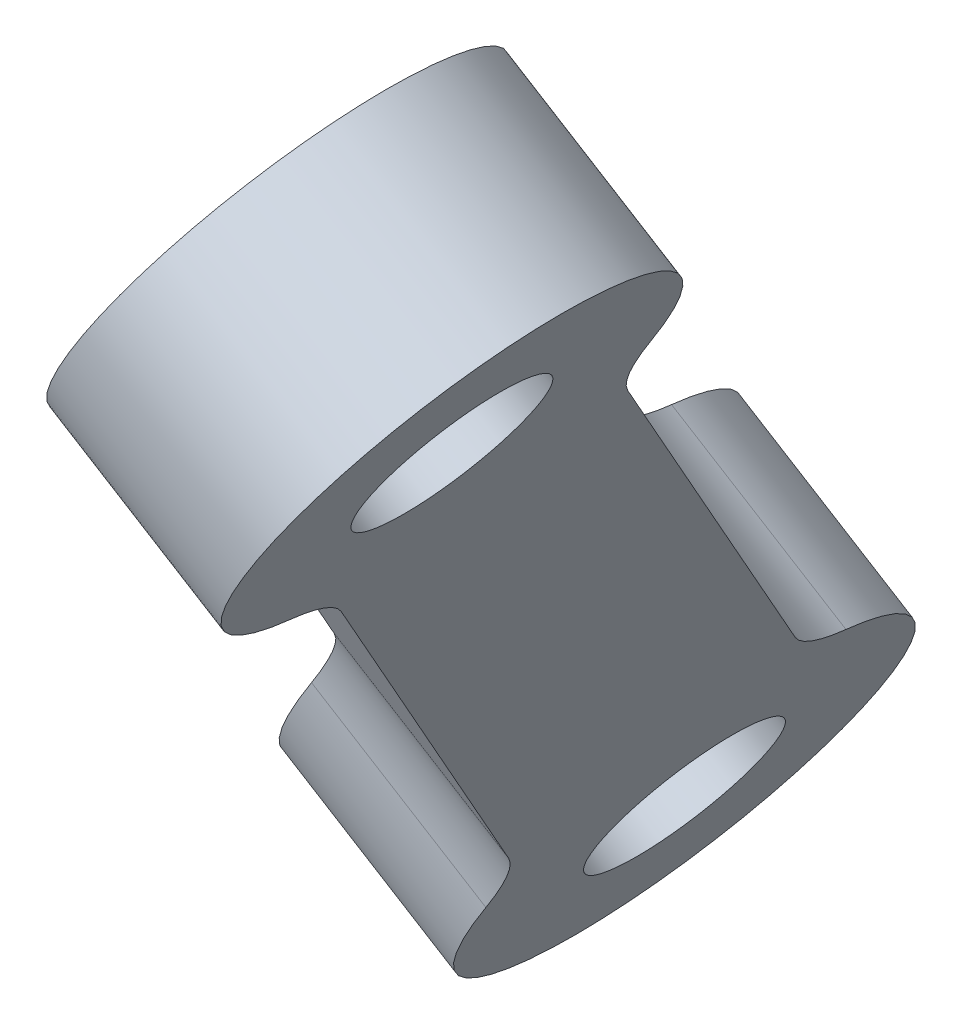
ISO-10303-21;
HEADER;
FILE_DESCRIPTION(('STEP AP214'),'2;1');
FILE_NAME('part.step','',(''),(''),'','','');
FILE_SCHEMA(('AUTOMOTIVE_DESIGN { 1 0 10303 214 1 1 1 1 }'));
ENDSEC;
DATA;
#1=APPLICATION_CONTEXT('core data for automotive mechanical design processes');
#2=APPLICATION_PROTOCOL_DEFINITION('international standard','automotive_design',2000,#1);
#3=PRODUCT_CONTEXT('',#1,'mechanical');
#4=PRODUCT('Part','Part','',(#3));
#5=PRODUCT_RELATED_PRODUCT_CATEGORY('part','',(#4));
#6=PRODUCT_DEFINITION_FORMATION('','',#4);
#7=PRODUCT_DEFINITION_CONTEXT('part definition',#1,'design');
#8=PRODUCT_DEFINITION('design','',#6,#7);
#9=PRODUCT_DEFINITION_SHAPE('','',#8);
#10=(LENGTH_UNIT() NAMED_UNIT(*) SI_UNIT(.MILLI.,.METRE.));
#11=(NAMED_UNIT(*) PLANE_ANGLE_UNIT() SI_UNIT($,.RADIAN.));
#12=(NAMED_UNIT(*) SI_UNIT($,.STERADIAN.) SOLID_ANGLE_UNIT());
#13=UNCERTAINTY_MEASURE_WITH_UNIT(LENGTH_MEASURE(1.E-05),#10,'distance_accuracy_value','');
#14=(GEOMETRIC_REPRESENTATION_CONTEXT(3) GLOBAL_UNCERTAINTY_ASSIGNED_CONTEXT((#13)) GLOBAL_UNIT_ASSIGNED_CONTEXT((#10,
#11,#12)) REPRESENTATION_CONTEXT('',''));
#15=CARTESIAN_POINT('',(0.,0.,0.));
#16=DIRECTION('',(0.,0.,1.));
#17=DIRECTION('',(1.,0.,0.));
#18=AXIS2_PLACEMENT_3D('',#15,#16,#17);
#19=CARTESIAN_POINT('',(-134.805143501858,232.893803125045,90.5474409174135));
#20=DIRECTION('',(-0.849388113162932,0.527762814669667,0.00249893366544743));
#21=DIRECTION('',(-0.527764462529551,-0.849390765249361,0.));
#22=AXIS2_PLACEMENT_3D('',#19,#20,#21);
#23=CYLINDRICAL_SURFACE('',#22,2.99999999999986);
#24=CARTESIAN_POINT('',(-138.202695954509,235.004854383724,90.5574366520753));
#25=DIRECTION('',(0.849388113162933,-0.527762814669667,-0.00249893366544743));
#26=DIRECTION('',(0.527764462529551,0.849390765249361,0.));
#27=AXIS2_PLACEMENT_3D('',#24,#25,#26);
#28=CIRCLE('',#27,2.99999999999986);
#29=CARTESIAN_POINT('',(-137.292181654821,236.481835615421,88.1100931634584));
#30=VERTEX_POINT('',#29);
#31=CARTESIAN_POINT('',(-136.686027982471,237.449821806389,89.7078175817281));
#32=VERTEX_POINT('',#31);
#33=EDGE_CURVE('E136',#30,#32,#28,.T.);
#34=ORIENTED_EDGE('',*,*,#33,.F.);
#35=DIRECTION('',(-0.849388113162932,0.527762814669667,0.00249893366544743));
#36=VECTOR('',#35,1.);
#37=CARTESIAN_POINT('',(-133.894629202169,234.370784356742,88.1000974287966));
#38=LINE('',#37,#36);
#39=CARTESIAN_POINT('',(-133.894629202169,234.370784356742,88.1000974287966));
#40=VERTEX_POINT('',#39);
#41=EDGE_CURVE('E11',#40,#30,#38,.T.);
#42=ORIENTED_EDGE('',*,*,#41,.F.);
#43=CARTESIAN_POINT('',(-134.805143501858,232.893803125045,90.5474409174135));
#44=DIRECTION('',(0.849388113162933,-0.527762814669667,-0.00249893366544743));
#45=DIRECTION('',(0.527764462529551,0.849390765249361,0.));
#46=AXIS2_PLACEMENT_3D('',#43,#44,#45);
#47=CIRCLE('',#46,2.99999999999986);
#48=CARTESIAN_POINT('',(-133.28847552982,235.33877054771,89.6978218470663));
#49=VERTEX_POINT('',#48);
#50=EDGE_CURVE('E160',#40,#49,#47,.T.);
#51=ORIENTED_EDGE('',*,*,#50,.T.);
#52=DIRECTION('',(-0.849388113162932,0.527762814669667,0.00249893366544743));
#53=VECTOR('',#52,1.);
#54=CARTESIAN_POINT('',(-133.28847552982,235.33877054771,89.6978218470663));
#55=LINE('',#54,#53);
#56=EDGE_CURVE('E45',#49,#32,#55,.T.);
#57=ORIENTED_EDGE('',*,*,#56,.T.);
#58=EDGE_LOOP('',(#34,#42,#51,#57));
#59=FACE_BOUND('',#58,.T.);
#60=ADVANCED_FACE('F39',(#59),#23,.F.);
#61=CARTESIAN_POINT('',(-143.54024468162,218.908186563002,75.1797870166888));
#62=DIRECTION('',(-0.303504766562868,-0.492327077232529,0.815781162872307));
#63=DIRECTION('',(0.,-0.856166610270368,-0.516699850452996));
#64=AXIS2_PLACEMENT_3D('',#61,#62,#63);
#65=PLANE('',#64);
#66=DIRECTION('',(0.431769255379691,0.692156384407184,0.578355297056439));
#67=VECTOR('',#66,1.);
#68=CARTESIAN_POINT('',(-146.937797134272,221.019237821681,75.1897827513506));
#69=LINE('',#68,#67);
#70=CARTESIAN_POINT('',(-146.937797134272,221.019237821681,75.1897827513506));
#71=VERTEX_POINT('',#70);
#72=EDGE_CURVE('E154',#71,#30,#69,.T.);
#73=ORIENTED_EDGE('',*,*,#72,.F.);
#74=DIRECTION('',(-0.849388113162932,0.527762814669667,0.00249893366544743));
#75=VECTOR('',#74,1.);
#76=CARTESIAN_POINT('',(-143.54024468162,218.908186563002,75.1797870166888));
#77=LINE('',#76,#75);
#78=CARTESIAN_POINT('',(-143.54024468162,218.908186563002,75.1797870166888));
#79=VERTEX_POINT('',#78);
#80=EDGE_CURVE('E48',#79,#71,#77,.T.);
#81=ORIENTED_EDGE('',*,*,#80,.F.);
#82=DIRECTION('',(0.431769255379691,0.692156384407184,0.578355297056439));
#83=VECTOR('',#82,1.);
#84=CARTESIAN_POINT('',(-143.54024468162,218.908186563002,75.1797870166888));
#85=LINE('',#84,#83);
#86=EDGE_CURVE('E127',#79,#40,#85,.T.);
#87=ORIENTED_EDGE('',*,*,#86,.T.);
#88=ORIENTED_EDGE('',*,*,#41,.T.);
#89=EDGE_LOOP('',(#73,#81,#87,#88));
#90=FACE_BOUND('',#89,.T.);
#91=ADVANCED_FACE('F166',(#90),#65,.T.);
#92=CARTESIAN_POINT('',(-144.450758981309,217.431205331304,77.6271305053057));
#93=DIRECTION('',(-0.849388113162932,0.527762814669667,0.00249893366544743));
#94=DIRECTION('',(-0.527764462529551,-0.849390765249361,0.));
#95=AXIS2_PLACEMENT_3D('',#92,#93,#94);
#96=CYLINDRICAL_SURFACE('',#95,2.99999999999999);
#97=CARTESIAN_POINT('',(-147.848311433961,219.542256589983,77.6371262399675));
#98=DIRECTION('',(0.849388113162933,-0.527762814669667,-0.00249893366544743));
#99=DIRECTION('',(0.527764462529551,0.849390765249361,0.));
#100=AXIS2_PLACEMENT_3D('',#97,#98,#99);
#101=CIRCLE('',#100,2.99999999999999);
#102=CARTESIAN_POINT('',(-147.934171220774,219.418259674271,74.6409198282025));
#103=VERTEX_POINT('',#102);
#104=EDGE_CURVE('E114',#103,#71,#101,.T.);
#105=ORIENTED_EDGE('',*,*,#104,.F.);
#106=DIRECTION('',(-0.849388113162932,0.527762814669667,0.00249893366544743));
#107=VECTOR('',#106,1.);
#108=CARTESIAN_POINT('',(-144.536618768122,217.307208415592,74.6309240935407));
#109=LINE('',#108,#107);
#110=CARTESIAN_POINT('',(-144.536618768122,217.307208415592,74.6309240935407));
#111=VERTEX_POINT('',#110);
#112=EDGE_CURVE('E107',#111,#103,#109,.T.);
#113=ORIENTED_EDGE('',*,*,#112,.F.);
#114=CARTESIAN_POINT('',(-144.450758981309,217.431205331304,77.6271305053057));
#115=DIRECTION('',(0.849388113162933,-0.527762814669667,-0.00249893366544743));
#116=DIRECTION('',(0.527764462529551,0.849390765249361,0.));
#117=AXIS2_PLACEMENT_3D('',#114,#115,#116);
#118=CIRCLE('',#117,2.99999999999999);
#119=EDGE_CURVE('E112',#111,#79,#118,.T.);
#120=ORIENTED_EDGE('',*,*,#119,.T.);
#121=ORIENTED_EDGE('',*,*,#80,.T.);
#122=EDGE_LOOP('',(#105,#113,#120,#121));
#123=FACE_BOUND('',#122,.T.);
#124=ADVANCED_FACE('F109',(#123),#96,.F.);
#125=CARTESIAN_POINT('',(-144.651098483873,217.141879194642,70.6359822111871));
#126=DIRECTION('',(-0.849388113162932,0.527762814669667,0.00249893366544743));
#127=DIRECTION('',(-0.527764462529551,-0.849390765249361,0.));
#128=AXIS2_PLACEMENT_3D('',#125,#126,#127);
#129=CYLINDRICAL_SURFACE('',#128,4.00000000000015);
#130=CARTESIAN_POINT('',(-148.048650936524,219.252930453321,70.6459779458489));
#131=DIRECTION('',(-0.849388113162933,0.527762814669667,0.00249893366544743));
#132=DIRECTION('',(-0.527764462529551,-0.849390765249361,0.));
#133=AXIS2_PLACEMENT_3D('',#130,#131,#132);
#134=CIRCLE('',#133,4.00000000000015);
#135=CARTESIAN_POINT('',(-146.026426973807,222.512887016875,69.5131525187193));
#136=VERTEX_POINT('',#135);
#137=EDGE_CURVE('E155',#136,#103,#134,.T.);
#138=ORIENTED_EDGE('',*,*,#137,.F.);
#139=DIRECTION('',(-0.849388113162932,0.527762814669667,0.00249893366544743));
#140=VECTOR('',#139,1.);
#141=CARTESIAN_POINT('',(-142.628874521155,220.401835758196,69.5031567840575));
#142=LINE('',#141,#140);
#143=CARTESIAN_POINT('',(-142.628874521155,220.401835758196,69.5031567840575));
#144=VERTEX_POINT('',#143);
#145=EDGE_CURVE('E119',#144,#136,#142,.T.);
#146=ORIENTED_EDGE('',*,*,#145,.F.);
#147=CARTESIAN_POINT('',(-144.651098483873,217.141879194642,70.6359822111871));
#148=DIRECTION('',(-0.849388113162933,0.527762814669667,0.00249893366544743));
#149=DIRECTION('',(-0.527764462529551,-0.849390765249361,0.));
#150=AXIS2_PLACEMENT_3D('',#147,#148,#149);
#151=CIRCLE('',#150,4.00000000000015);
#152=EDGE_CURVE('E123',#144,#111,#151,.T.);
#153=ORIENTED_EDGE('',*,*,#152,.T.);
#154=ORIENTED_EDGE('',*,*,#112,.T.);
#155=EDGE_LOOP('',(#138,#146,#153,#154));
#156=FACE_BOUND('',#155,.T.);
#157=ADVANCED_FACE('F126',(#156),#129,.T.);
#158=CARTESIAN_POINT('',(-141.112206549117,222.846803180862,68.6535377137103));
#159=DIRECTION('',(-0.849388113162932,0.527762814669667,0.00249893366544743));
#160=DIRECTION('',(-0.527764462529551,-0.849390765249361,0.));
#161=AXIS2_PLACEMENT_3D('',#158,#159,#160);
#162=CYLINDRICAL_SURFACE('',#161,2.99999999999989);
#163=CARTESIAN_POINT('',(-144.509759001769,224.957854439541,68.6635334483721));
#164=DIRECTION('',(0.849388113162933,-0.527762814669667,-0.00249893366544743));
#165=DIRECTION('',(0.527764462529551,0.849390765249361,0.));
#166=AXIS2_PLACEMENT_3D('',#163,#164,#165);
#167=CIRCLE('',#166,2.99999999999989);
#168=CARTESIAN_POINT('',(-145.420273301458,223.480873207843,71.110876936989));
#169=VERTEX_POINT('',#168);
#170=EDGE_CURVE('E149',#169,#136,#167,.T.);
#171=ORIENTED_EDGE('',*,*,#170,.F.);
#172=DIRECTION('',(-0.849388113162932,0.527762814669667,0.00249893366544743));
#173=VECTOR('',#172,1.);
#174=CARTESIAN_POINT('',(-142.022720848806,221.369821949164,71.1008812023272));
#175=LINE('',#174,#173);
#176=CARTESIAN_POINT('',(-142.022720848806,221.369821949164,71.1008812023272));
#177=VERTEX_POINT('',#176);
#178=EDGE_CURVE('E161',#177,#169,#175,.T.);
#179=ORIENTED_EDGE('',*,*,#178,.F.);
#180=CARTESIAN_POINT('',(-141.112206549117,222.846803180862,68.6535377137103));
#181=DIRECTION('',(0.849388113162933,-0.527762814669667,-0.00249893366544743));
#182=DIRECTION('',(0.527764462529551,0.849390765249361,0.));
#183=AXIS2_PLACEMENT_3D('',#180,#181,#182);
#184=CIRCLE('',#183,2.99999999999989);
#185=EDGE_CURVE('E129',#177,#144,#184,.T.);
#186=ORIENTED_EDGE('',*,*,#185,.T.);
#187=ORIENTED_EDGE('',*,*,#145,.T.);
#188=EDGE_LOOP('',(#171,#179,#186,#187));
#189=FACE_BOUND('',#188,.T.);
#190=ADVANCED_FACE('F185',(#189),#162,.F.);
#191=CARTESIAN_POINT('',(-132.377105369355,236.832419742905,84.021191614435));
#192=DIRECTION('',(0.303504766562867,0.492327077232528,-0.815781162872308));
#193=DIRECTION('',(0.,0.856166610270369,0.516699850452994));
#194=AXIS2_PLACEMENT_3D('',#191,#192,#193);
#195=PLANE('',#194);
#196=DIRECTION('',(-0.43176925537969,-0.692156384407186,-0.578355297056437));
#197=VECTOR('',#196,1.);
#198=CARTESIAN_POINT('',(-135.774657822006,238.943471001584,84.0311873490968));
#199=LINE('',#198,#197);
#200=CARTESIAN_POINT('',(-135.774657822006,238.943471001584,84.0311873490967));
#201=VERTEX_POINT('',#200);
#202=EDGE_CURVE('E148',#201,#169,#199,.T.);
#203=ORIENTED_EDGE('',*,*,#202,.F.);
#204=DIRECTION('',(-0.849388113162932,0.527762814669667,0.00249893366544743));
#205=VECTOR('',#204,1.);
#206=CARTESIAN_POINT('',(-132.377105369355,236.832419742905,84.021191614435));
#207=LINE('',#206,#205);
#208=CARTESIAN_POINT('',(-132.377105369355,236.832419742905,84.021191614435));
#209=VERTEX_POINT('',#208);
#210=EDGE_CURVE('E162',#209,#201,#207,.T.);
#211=ORIENTED_EDGE('',*,*,#210,.F.);
#212=DIRECTION('',(-0.43176925537969,-0.692156384407186,-0.578355297056437));
#213=VECTOR('',#212,1.);
#214=CARTESIAN_POINT('',(-132.377105369355,236.832419742905,84.021191614435));
#215=LINE('',#214,#213);
#216=EDGE_CURVE('E132',#209,#177,#215,.T.);
#217=ORIENTED_EDGE('',*,*,#216,.T.);
#218=ORIENTED_EDGE('',*,*,#178,.T.);
#219=EDGE_LOOP('',(#203,#211,#217,#218));
#220=FACE_BOUND('',#219,.T.);
#221=ADVANCED_FACE('F183',(#220),#195,.T.);
#222=CARTESIAN_POINT('',(-131.466591069666,238.309400974603,81.5738481258181));
#223=DIRECTION('',(-0.849388113162932,0.527762814669667,0.00249893366544743));
#224=DIRECTION('',(-0.527764462529551,-0.849390765249361,0.));
#225=AXIS2_PLACEMENT_3D('',#222,#223,#224);
#226=CYLINDRICAL_SURFACE('',#225,3.00000000000009);
#227=CARTESIAN_POINT('',(-134.864143522318,240.420452233282,81.5838438604799));
#228=DIRECTION('',(0.849388113162933,-0.527762814669667,-0.00249893366544743));
#229=DIRECTION('',(0.527764462529551,0.849390765249361,0.));
#230=AXIS2_PLACEMENT_3D('',#227,#228,#229);
#231=CIRCLE('',#230,3.00000000000009);
#232=CARTESIAN_POINT('',(-134.778283735505,240.544449148994,84.580050272245));
#233=VERTEX_POINT('',#232);
#234=EDGE_CURVE('E141',#233,#201,#231,.T.);
#235=ORIENTED_EDGE('',*,*,#234,.F.);
#236=DIRECTION('',(-0.849388113162932,0.527762814669667,0.00249893366544743));
#237=VECTOR('',#236,1.);
#238=CARTESIAN_POINT('',(-131.380731282853,238.433397890315,84.5700545375832));
#239=LINE('',#238,#237);
#240=CARTESIAN_POINT('',(-131.380731282853,238.433397890315,84.5700545375832));
#241=VERTEX_POINT('',#240);
#242=EDGE_CURVE('E163',#241,#233,#239,.T.);
#243=ORIENTED_EDGE('',*,*,#242,.F.);
#244=CARTESIAN_POINT('',(-131.466591069666,238.309400974603,81.5738481258181));
#245=DIRECTION('',(0.849388113162933,-0.527762814669667,-0.00249893366544743));
#246=DIRECTION('',(0.527764462529551,0.849390765249361,0.));
#247=AXIS2_PLACEMENT_3D('',#244,#245,#246);
#248=CIRCLE('',#247,3.00000000000009);
#249=EDGE_CURVE('E231',#241,#209,#248,.T.);
#250=ORIENTED_EDGE('',*,*,#249,.T.);
#251=ORIENTED_EDGE('',*,*,#210,.T.);
#252=EDGE_LOOP('',(#235,#243,#250,#251));
#253=FACE_BOUND('',#252,.T.);
#254=ADVANCED_FACE('F186',(#253),#226,.F.);
#255=CARTESIAN_POINT('',(-131.266251567102,238.598727111265,88.5649964199367));
#256=DIRECTION('',(-0.849388113162932,0.527762814669667,0.00249893366544743));
#257=DIRECTION('',(-0.527764462529551,-0.849390765249361,0.));
#258=AXIS2_PLACEMENT_3D('',#255,#256,#257);
#259=CYLINDRICAL_SURFACE('',#258,4.0000000000001);
#260=CARTESIAN_POINT('',(-134.663804019754,240.709778369943,88.5749921545985));
#261=DIRECTION('',(-0.849388113162933,0.527762814669667,0.00249893366544743));
#262=DIRECTION('',(-0.527764462529551,-0.849390765249361,0.));
#263=AXIS2_PLACEMENT_3D('',#260,#261,#262);
#264=CIRCLE('',#263,4.0000000000001);
#265=EDGE_CURVE('E138',#32,#233,#264,.T.);
#266=ORIENTED_EDGE('',*,*,#265,.F.);
#267=ORIENTED_EDGE('',*,*,#56,.F.);
#268=CARTESIAN_POINT('',(-131.266251567102,238.598727111265,88.5649964199367));
#269=DIRECTION('',(-0.849388113162933,0.527762814669667,0.00249893366544743));
#270=DIRECTION('',(-0.527764462529551,-0.849390765249361,0.));
#271=AXIS2_PLACEMENT_3D('',#268,#269,#270);
#272=CIRCLE('',#271,4.0000000000001);
#273=EDGE_CURVE('E226',#49,#241,#272,.T.);
#274=ORIENTED_EDGE('',*,*,#273,.T.);
#275=ORIENTED_EDGE('',*,*,#242,.T.);
#276=EDGE_LOOP('',(#266,#267,#274,#275));
#277=FACE_BOUND('',#276,.T.);
#278=ADVANCED_FACE('F167',(#277),#259,.T.);
#279=CARTESIAN_POINT('',(-134.805143501858,232.893803125045,90.5474409174135));
#280=DIRECTION('',(0.849388113162933,-0.527762814669667,-0.00249893366544743));
#281=DIRECTION('',(0.527764462529551,0.849390765249361,0.));
#282=AXIS2_PLACEMENT_3D('',#279,#280,#281);
#283=PLANE('',#282);
#284=CARTESIAN_POINT('',(-144.651098483873,217.141879194642,70.6359822111871));
#285=DIRECTION('',(-0.849388113162933,0.527762814669667,0.00249893366544743));
#286=DIRECTION('',(0.527764462529551,0.849390765249361,0.));
#287=AXIS2_PLACEMENT_3D('',#284,#285,#286);
#288=CIRCLE('',#287,1.75000000000001);
#289=CARTESIAN_POINT('',(-145.574686293299,215.655445355455,70.6359822111871));
#290=VERTEX_POINT('',#289);
#291=EDGE_CURVE('E216',#290,#290,#288,.T.);
#292=ORIENTED_EDGE('',*,*,#291,.T.);
#293=EDGE_LOOP('',(#292));
#294=FACE_BOUND('',#293,.T.);
#295=CARTESIAN_POINT('',(-131.266251567102,238.598727111265,88.5649964199367));
#296=DIRECTION('',(-0.849388113162933,0.527762814669667,0.00249893366544743));
#297=DIRECTION('',(0.527764462529551,0.849390765249361,0.));
#298=AXIS2_PLACEMENT_3D('',#295,#296,#297);
#299=CIRCLE('',#298,1.75);
#300=CARTESIAN_POINT('',(-132.189839376529,237.112293272078,88.5649964199367));
#301=VERTEX_POINT('',#300);
#302=EDGE_CURVE('E140',#301,#301,#299,.T.);
#303=ORIENTED_EDGE('',*,*,#302,.T.);
#304=EDGE_LOOP('',(#303));
#305=FACE_BOUND('',#304,.T.);
#306=ORIENTED_EDGE('',*,*,#50,.F.);
#307=ORIENTED_EDGE('',*,*,#86,.F.);
#308=ORIENTED_EDGE('',*,*,#119,.F.);
#309=ORIENTED_EDGE('',*,*,#152,.F.);
#310=ORIENTED_EDGE('',*,*,#185,.F.);
#311=ORIENTED_EDGE('',*,*,#216,.F.);
#312=ORIENTED_EDGE('',*,*,#249,.F.);
#313=ORIENTED_EDGE('',*,*,#273,.F.);
#314=EDGE_LOOP('',(#306,#307,#308,#309,#310,#311,#312,#313));
#315=FACE_BOUND('',#314,.T.);
#316=ADVANCED_FACE('F122',(#294,#305,#315),#283,.T.);
#317=CARTESIAN_POINT('',(-138.202695954509,235.004854383724,90.5574366520753));
#318=DIRECTION('',(0.849388113162933,-0.527762814669667,-0.00249893366544743));
#319=DIRECTION('',(0.527764462529551,0.849390765249361,0.));
#320=AXIS2_PLACEMENT_3D('',#317,#318,#319);
#321=PLANE('',#320);
#322=CARTESIAN_POINT('',(-148.048650936524,219.252930453321,70.6459779458489));
#323=DIRECTION('',(-0.849388113162933,0.527762814669667,0.00249893366544743));
#324=DIRECTION('',(0.527764462529551,0.849390765249361,0.));
#325=AXIS2_PLACEMENT_3D('',#322,#323,#324);
#326=CIRCLE('',#325,1.75000000000001);
#327=CARTESIAN_POINT('',(-148.972238745951,217.766496614134,70.6459779458489));
#328=VERTEX_POINT('',#327);
#329=EDGE_CURVE('E218',#328,#328,#326,.T.);
#330=ORIENTED_EDGE('',*,*,#329,.F.);
#331=EDGE_LOOP('',(#330));
#332=FACE_BOUND('',#331,.T.);
#333=CARTESIAN_POINT('',(-134.663804019754,240.709778369943,88.5749921545985));
#334=DIRECTION('',(-0.849388113162933,0.527762814669667,0.00249893366544743));
#335=DIRECTION('',(0.527764462529551,0.849390765249361,0.));
#336=AXIS2_PLACEMENT_3D('',#333,#334,#335);
#337=CIRCLE('',#336,1.75);
#338=CARTESIAN_POINT('',(-135.587391829181,239.223344530757,88.5749921545985));
#339=VERTEX_POINT('',#338);
#340=EDGE_CURVE('E222',#339,#339,#337,.T.);
#341=ORIENTED_EDGE('',*,*,#340,.F.);
#342=EDGE_LOOP('',(#341));
#343=FACE_BOUND('',#342,.T.);
#344=ORIENTED_EDGE('',*,*,#33,.T.);
#345=ORIENTED_EDGE('',*,*,#265,.T.);
#346=ORIENTED_EDGE('',*,*,#234,.T.);
#347=ORIENTED_EDGE('',*,*,#202,.T.);
#348=ORIENTED_EDGE('',*,*,#170,.T.);
#349=ORIENTED_EDGE('',*,*,#137,.T.);
#350=ORIENTED_EDGE('',*,*,#104,.T.);
#351=ORIENTED_EDGE('',*,*,#72,.T.);
#352=EDGE_LOOP('',(#344,#345,#346,#347,#348,#349,#350,#351));
#353=FACE_BOUND('',#352,.T.);
#354=ADVANCED_FACE('F169',(#332,#343,#353),#321,.F.);
#355=CARTESIAN_POINT('',(-131.266251567102,238.598727111265,88.5649964199367));
#356=DIRECTION('',(-0.849388113162932,0.527762814669667,0.00249893366544743));
#357=DIRECTION('',(-0.527764462529551,-0.849390765249361,0.));
#358=AXIS2_PLACEMENT_3D('',#355,#356,#357);
#359=CYLINDRICAL_SURFACE('',#358,1.75);
#360=CARTESIAN_POINT('',(-132.189839376529,237.112293272078,88.5649964199367));
#361=CARTESIAN_POINT('',(-132.225230547911,237.134283389356,88.5651005421728));
#362=CARTESIAN_POINT('',(-132.260621719293,237.156273506634,88.5652046644089));
#363=CARTESIAN_POINT('',(-132.331404062056,237.20025374119,88.565412908881));
#364=CARTESIAN_POINT('',(-132.366795233438,237.222243858468,88.565517031117));
#365=CARTESIAN_POINT('',(-132.437577576202,237.266224093024,88.5657252755891));
#366=CARTESIAN_POINT('',(-132.472968747583,237.288214210302,88.5658293978252));
#367=CARTESIAN_POINT('',(-132.543751090347,237.332194444857,88.5660376422973));
#368=CARTESIAN_POINT('',(-132.579142261729,237.354184562135,88.5661417645334));
#369=CARTESIAN_POINT('',(-132.649924604492,237.398164796691,88.5663500090055));
#370=CARTESIAN_POINT('',(-132.685315775874,237.420154913969,88.5664541312416));
#371=CARTESIAN_POINT('',(-132.756098118638,237.464135148525,88.5666623757137));
#372=CARTESIAN_POINT('',(-132.791489290019,237.486125265803,88.5667664979498));
#373=CARTESIAN_POINT('',(-132.862271632783,237.530105500359,88.5669747424219));
#374=CARTESIAN_POINT('',(-132.897662804165,237.552095617636,88.5670788646579));
#375=CARTESIAN_POINT('',(-132.968445146928,237.596075852192,88.5672871091301));
#376=CARTESIAN_POINT('',(-133.00383631831,237.61806596947,88.5673912313661));
#377=CARTESIAN_POINT('',(-133.074618661074,237.662046204026,88.5675994758383));
#378=CARTESIAN_POINT('',(-133.110009832455,237.684036321304,88.5677035980743));
#379=CARTESIAN_POINT('',(-133.180792175219,237.72801655586,88.5679118425464));
#380=CARTESIAN_POINT('',(-133.216183346601,237.750006673138,88.5680159647825));
#381=CARTESIAN_POINT('',(-133.286965689364,237.793986907693,88.5682242092546));
#382=CARTESIAN_POINT('',(-133.322356860746,237.815977024971,88.5683283314907));
#383=CARTESIAN_POINT('',(-133.39313920351,237.859957259527,88.5685365759628));
#384=CARTESIAN_POINT('',(-133.428530374892,237.881947376805,88.5686406981988));
#385=CARTESIAN_POINT('',(-133.499312717655,237.925927611361,88.568848942671));
#386=CARTESIAN_POINT('',(-133.534703889037,237.947917728639,88.568953064907));
#387=CARTESIAN_POINT('',(-133.605486231801,237.991897963195,88.5691613093791));
#388=CARTESIAN_POINT('',(-133.640877403182,238.013888080472,88.5692654316152));
#389=CARTESIAN_POINT('',(-133.711659745946,238.057868315028,88.5694736760873));
#390=CARTESIAN_POINT('',(-133.747050917328,238.079858432306,88.5695777983234));
#391=CARTESIAN_POINT('',(-133.817833260091,238.123838666862,88.5697860427955));
#392=CARTESIAN_POINT('',(-133.853224431473,238.14582878414,88.5698901650316));
#393=CARTESIAN_POINT('',(-133.924006774237,238.189809018696,88.5700984095037));
#394=CARTESIAN_POINT('',(-133.959397945618,238.211799135974,88.5702025317398));
#395=CARTESIAN_POINT('',(-134.030180288382,238.255779370529,88.5704107762119));
#396=CARTESIAN_POINT('',(-134.065571459764,238.277769487807,88.5705148984479));
#397=CARTESIAN_POINT('',(-134.136353802527,238.321749722363,88.57072314292));
#398=CARTESIAN_POINT('',(-134.171744973909,238.343739839641,88.5708272651561));
#399=CARTESIAN_POINT('',(-134.242527316673,238.387720074197,88.5710355096282));
#400=CARTESIAN_POINT('',(-134.277918488054,238.409710191475,88.5711396318643));
#401=CARTESIAN_POINT('',(-134.348700830818,238.453690426031,88.5713478763364));
#402=CARTESIAN_POINT('',(-134.3840920022,238.475680543308,88.5714519985725));
#403=CARTESIAN_POINT('',(-134.454874344963,238.519660777864,88.5716602430446));
#404=CARTESIAN_POINT('',(-134.490265516345,238.541650895142,88.5717643652807));
#405=CARTESIAN_POINT('',(-134.561047859109,238.585631129698,88.5719726097528));
#406=CARTESIAN_POINT('',(-134.596439030491,238.607621246976,88.5720767319888));
#407=CARTESIAN_POINT('',(-134.667221373254,238.651601481532,88.5722849764609));
#408=CARTESIAN_POINT('',(-134.702612544636,238.67359159881,88.572389098697));
#409=CARTESIAN_POINT('',(-134.7733948874,238.717571833365,88.5725973431692));
#410=CARTESIAN_POINT('',(-134.808786058781,238.739561950643,88.5727014654052));
#411=CARTESIAN_POINT('',(-134.879568401545,238.783542185199,88.5729097098773));
#412=CARTESIAN_POINT('',(-134.914959572927,238.805532302477,88.5730138321134));
#413=CARTESIAN_POINT('',(-134.98574191569,238.849512537033,88.5732220765855));
#414=CARTESIAN_POINT('',(-135.021133087072,238.871502654311,88.5733261988216));
#415=CARTESIAN_POINT('',(-135.091915429836,238.915482888866,88.5735344432937));
#416=CARTESIAN_POINT('',(-135.127306601217,238.937473006144,88.5736385655297));
#417=CARTESIAN_POINT('',(-135.198088943981,238.9814532407,88.5738468100019));
#418=CARTESIAN_POINT('',(-135.233480115363,239.003443357978,88.5739509322379));
#419=CARTESIAN_POINT('',(-135.304262458126,239.047423592534,88.57415917671));
#420=CARTESIAN_POINT('',(-135.339653629508,239.069413709812,88.5742632989461));
#421=CARTESIAN_POINT('',(-135.410435972272,239.113393944368,88.5744715434182));
#422=CARTESIAN_POINT('',(-135.445827143654,239.135384061645,88.5745756656543));
#423=CARTESIAN_POINT('',(-135.516609486417,239.179364296201,88.5747839101264));
#424=CARTESIAN_POINT('',(-135.552000657799,239.201354413479,88.5748880323625));
#425=CARTESIAN_POINT('',(-135.587391829181,239.223344530757,88.5749921545985));
#426=B_SPLINE_CURVE_WITH_KNOTS('',3,(#360,#361,#362,#363,#364,#365,#366,#367,#368,#369,#370,
#371,#372,#373,#374,#375,#376,#377,#378,#379,#380,#381,#382,#383,#384,#385,#386,#387,#388,#389,
#390,#391,#392,#393,#394,#395,#396,#397,#398,#399,#400,#401,#402,#403,#404,#405,#406,#407,#408,
#409,#410,#411,#412,#413,#414,#415,#416,#417,#418,#419,#420,#421,#422,#423,#424,#425),
.UNSPECIFIED.,.F.,.F.,(4,2,2,2,2,2,2,2,2,2,2,2,2,2,2,2,2,2,2,2,2,2,2,2,2,2,2,2,2,2,2,2,4),(0.,
0.124999999999983,0.24999999999999,0.374999999999988,0.499999999999972,0.624999999999978,0.75,
0.874999999999983,0.99999999999999,1.12499999999997,1.25,1.37499999999998,1.49999999999996,
1.62499999999998,1.74999999999999,1.87499999999997,1.99999999999997,2.12499999999998,
2.24999999999999,2.37499999999998,2.49999999999997,2.62499999999997,2.74999999999998,
2.87499999999998,2.99999999999996,3.12499999999997,3.24999999999999,3.37499999999997,
3.49999999999996,3.62499999999998,3.74999999999999,3.87499999999997,3.99999999999997),.UNSPECIFIED.);
#427=EDGE_CURVE('BSEAM203',#301,#339,#426,.T.);
#428=ORIENTED_EDGE('',*,*,#302,.F.);
#429=ORIENTED_EDGE('',*,*,#340,.T.);
#430=ORIENTED_EDGE('',*,*,#427,.T.);
#431=ORIENTED_EDGE('',*,*,#427,.F.);
#432=EDGE_LOOP('',(#428,#430,#429,#431));
#433=FACE_BOUND('',#432,.T.);
#434=ADVANCED_FACE('F203',(#433),#359,.F.);
#435=CARTESIAN_POINT('',(-144.651098483873,217.141879194642,70.6359822111871));
#436=DIRECTION('',(-0.849388113162932,0.527762814669667,0.00249893366544743));
#437=DIRECTION('',(-0.527764462529551,-0.849390765249361,0.));
#438=AXIS2_PLACEMENT_3D('',#435,#436,#437);
#439=CYLINDRICAL_SURFACE('',#438,1.75000000000001);
#440=CARTESIAN_POINT('',(-145.574686293299,215.655445355455,70.6359822111871));
#441=CARTESIAN_POINT('',(-145.610077464681,215.677435472733,70.6360863334232));
#442=CARTESIAN_POINT('',(-145.645468636063,215.699425590011,70.6361904556592));
#443=CARTESIAN_POINT('',(-145.716250978827,215.743405824567,70.6363987001314));
#444=CARTESIAN_POINT('',(-145.751642150208,215.765395941845,70.6365028223674));
#445=CARTESIAN_POINT('',(-145.822424492972,215.809376176401,70.6367110668395));
#446=CARTESIAN_POINT('',(-145.857815664354,215.831366293679,70.6368151890756));
#447=CARTESIAN_POINT('',(-145.928598007117,215.875346528235,70.6370234335477));
#448=CARTESIAN_POINT('',(-145.963989178499,215.897336645512,70.6371275557838));
#449=CARTESIAN_POINT('',(-146.034771521263,215.941316880068,70.6373358002559));
#450=CARTESIAN_POINT('',(-146.070162692645,215.963306997346,70.637439922492));
#451=CARTESIAN_POINT('',(-146.140945035408,216.007287231902,70.6376481669641));
#452=CARTESIAN_POINT('',(-146.17633620679,216.02927734918,70.6377522892002));
#453=CARTESIAN_POINT('',(-146.247118549554,216.073257583736,70.6379605336723));
#454=CARTESIAN_POINT('',(-146.282509720935,216.095247701014,70.6380646559083));
#455=CARTESIAN_POINT('',(-146.353292063699,216.139227935569,70.6382729003805));
#456=CARTESIAN_POINT('',(-146.388683235081,216.161218052847,70.6383770226165));
#457=CARTESIAN_POINT('',(-146.459465577844,216.205198287403,70.6385852670886));
#458=CARTESIAN_POINT('',(-146.494856749226,216.227188404681,70.6386893893247));
#459=CARTESIAN_POINT('',(-146.56563909199,216.271168639237,70.6388976337968));
#460=CARTESIAN_POINT('',(-146.601030263371,216.293158756515,70.6390017560329));
#461=CARTESIAN_POINT('',(-146.671812606135,216.33713899107,70.639210000505));
#462=CARTESIAN_POINT('',(-146.707203777517,216.359129108348,70.6393141227411));
#463=CARTESIAN_POINT('',(-146.77798612028,216.403109342904,70.6395223672132));
#464=CARTESIAN_POINT('',(-146.813377291662,216.425099460182,70.6396264894492));
#465=CARTESIAN_POINT('',(-146.884159634426,216.469079694738,70.6398347339213));
#466=CARTESIAN_POINT('',(-146.919550805807,216.491069812016,70.6399388561574));
#467=CARTESIAN_POINT('',(-146.990333148571,216.535050046572,70.6401471006295));
#468=CARTESIAN_POINT('',(-147.025724319953,216.55704016385,70.6402512228656));
#469=CARTESIAN_POINT('',(-147.096506662716,216.601020398405,70.6404594673377));
#470=CARTESIAN_POINT('',(-147.131897834098,216.623010515683,70.6405635895738));
#471=CARTESIAN_POINT('',(-147.202680176862,216.666990750239,70.6407718340459));
#472=CARTESIAN_POINT('',(-147.238071348244,216.688980867517,70.640875956282));
#473=CARTESIAN_POINT('',(-147.308853691007,216.732961102073,70.6410842007541));
#474=CARTESIAN_POINT('',(-147.344244862389,216.754951219351,70.6411883229901));
#475=CARTESIAN_POINT('',(-147.415027205153,216.798931453906,70.6413965674623));
#476=CARTESIAN_POINT('',(-147.450418376534,216.820921571184,70.6415006896983));
#477=CARTESIAN_POINT('',(-147.521200719298,216.86490180574,70.6417089341704));
#478=CARTESIAN_POINT('',(-147.55659189068,216.886891923018,70.6418130564065));
#479=CARTESIAN_POINT('',(-147.627374233443,216.930872157574,70.6420213008786));
#480=CARTESIAN_POINT('',(-147.662765404825,216.952862274852,70.6421254231147));
#481=CARTESIAN_POINT('',(-147.733547747589,216.996842509408,70.6423336675868));
#482=CARTESIAN_POINT('',(-147.76893891897,217.018832626685,70.6424377898229));
#483=CARTESIAN_POINT('',(-147.839721261734,217.062812861241,70.642646034295));
#484=CARTESIAN_POINT('',(-147.875112433116,217.084802978519,70.642750156531));
#485=CARTESIAN_POINT('',(-147.945894775879,217.128783213075,70.6429584010032));
#486=CARTESIAN_POINT('',(-147.981285947261,217.150773330353,70.6430625232392));
#487=CARTESIAN_POINT('',(-148.052068290025,217.194753564909,70.6432707677114));
#488=CARTESIAN_POINT('',(-148.087459461406,217.216743682187,70.6433748899474));
#489=CARTESIAN_POINT('',(-148.15824180417,217.260723916742,70.6435831344195));
#490=CARTESIAN_POINT('',(-148.193632975552,217.28271403402,70.6436872566556));
#491=CARTESIAN_POINT('',(-148.264415318315,217.326694268576,70.6438955011277));
#492=CARTESIAN_POINT('',(-148.299806489697,217.348684385854,70.6439996233638));
#493=CARTESIAN_POINT('',(-148.370588832461,217.39266462041,70.6442078678359));
#494=CARTESIAN_POINT('',(-148.405980003843,217.414654737688,70.644311990072));
#495=CARTESIAN_POINT('',(-148.476762346606,217.458634972244,70.6445202345441));
#496=CARTESIAN_POINT('',(-148.512153517988,217.480625089521,70.6446243567801));
#497=CARTESIAN_POINT('',(-148.582935860752,217.524605324077,70.6448326012522));
#498=CARTESIAN_POINT('',(-148.618327032133,217.546595441355,70.6449367234883));
#499=CARTESIAN_POINT('',(-148.689109374897,217.590575675911,70.6451449679604));
#500=CARTESIAN_POINT('',(-148.724500546279,217.612565793189,70.6452490901965));
#501=CARTESIAN_POINT('',(-148.795282889042,217.656546027745,70.6454573346686));
#502=CARTESIAN_POINT('',(-148.830674060424,217.678536145023,70.6455614569047));
#503=CARTESIAN_POINT('',(-148.901456403188,217.722516379578,70.6457697013768));
#504=CARTESIAN_POINT('',(-148.936847574569,217.744506496856,70.6458738236129));
#505=CARTESIAN_POINT('',(-148.972238745951,217.766496614134,70.6459779458489));
#506=B_SPLINE_CURVE_WITH_KNOTS('',3,(#440,#441,#442,#443,#444,#445,#446,#447,#448,#449,#450,
#451,#452,#453,#454,#455,#456,#457,#458,#459,#460,#461,#462,#463,#464,#465,#466,#467,#468,#469,
#470,#471,#472,#473,#474,#475,#476,#477,#478,#479,#480,#481,#482,#483,#484,#485,#486,#487,#488,
#489,#490,#491,#492,#493,#494,#495,#496,#497,#498,#499,#500,#501,#502,#503,#504,#505),
.UNSPECIFIED.,.F.,.F.,(4,2,2,2,2,2,2,2,2,2,2,2,2,2,2,2,2,2,2,2,2,2,2,2,2,2,2,2,2,2,2,2,4),(0.,
0.125000000000022,0.250000000000028,0.375000000000012,0.500000000000033,0.625000000000017,
0.750000000000023,0.875000000000007,1.,1.12500000000001,1.25000000000002,1.37500000000002,1.5,
1.62500000000001,1.75000000000003,1.87500000000001,2.00000000000002,2.12500000000002,
2.25000000000002,2.37500000000001,2.50000000000001,2.62500000000001,2.75000000000002,2.875,3.,
3.12500000000001,3.25000000000001,3.37500000000001,3.50000000000002,3.625,3.75000000000002,
3.87500000000001,4.00000000000001),.UNSPECIFIED.);
#507=EDGE_CURVE('BSEAM208',#290,#328,#506,.T.);
#508=ORIENTED_EDGE('',*,*,#291,.F.);
#509=ORIENTED_EDGE('',*,*,#329,.T.);
#510=ORIENTED_EDGE('',*,*,#507,.T.);
#511=ORIENTED_EDGE('',*,*,#507,.F.);
#512=EDGE_LOOP('',(#508,#510,#509,#511));
#513=FACE_BOUND('',#512,.T.);
#514=ADVANCED_FACE('F208',(#513),#439,.F.);
#515=CLOSED_SHELL('',(#60,#91,#124,#157,#190,#221,#254,#278,#316,#354,#434,#514));
#516=MANIFOLD_SOLID_BREP('B2',#515);
#517=ADVANCED_BREP_SHAPE_REPRESENTATION('',(#18,#516),#14);
#518=SHAPE_DEFINITION_REPRESENTATION(#9,#517);
ENDSEC;
END-ISO-10303-21;
